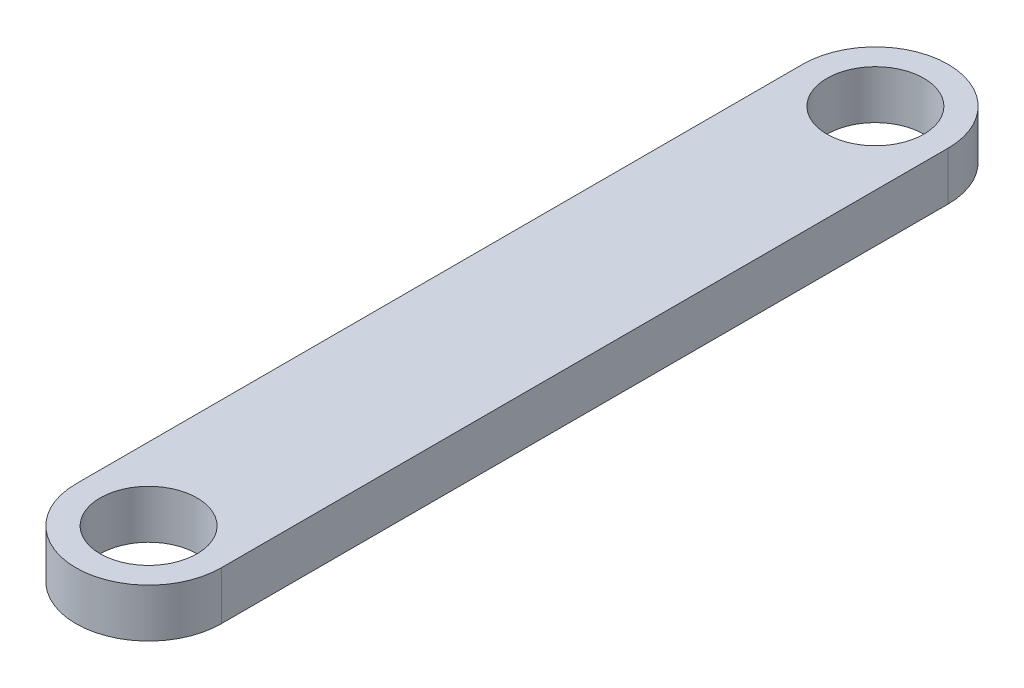
ISO-10303-21;
HEADER;
FILE_DESCRIPTION(('STEP AP214'),'2;1');
FILE_NAME('part.step','',(''),(''),'','','');
FILE_SCHEMA(('AUTOMOTIVE_DESIGN { 1 0 10303 214 1 1 1 1 }'));
ENDSEC;
DATA;
#1=APPLICATION_CONTEXT('core data for automotive mechanical design processes');
#2=APPLICATION_PROTOCOL_DEFINITION('international standard','automotive_design',2000,#1);
#3=PRODUCT_CONTEXT('',#1,'mechanical');
#4=PRODUCT('Part','Part','',(#3));
#5=PRODUCT_RELATED_PRODUCT_CATEGORY('part','',(#4));
#6=PRODUCT_DEFINITION_FORMATION('','',#4);
#7=PRODUCT_DEFINITION_CONTEXT('part definition',#1,'design');
#8=PRODUCT_DEFINITION('design','',#6,#7);
#9=PRODUCT_DEFINITION_SHAPE('','',#8);
#10=(LENGTH_UNIT() NAMED_UNIT(*) SI_UNIT(.MILLI.,.METRE.));
#11=(NAMED_UNIT(*) PLANE_ANGLE_UNIT() SI_UNIT($,.RADIAN.));
#12=(NAMED_UNIT(*) SI_UNIT($,.STERADIAN.) SOLID_ANGLE_UNIT());
#13=UNCERTAINTY_MEASURE_WITH_UNIT(LENGTH_MEASURE(1.E-05),#10,'distance_accuracy_value','');
#14=(GEOMETRIC_REPRESENTATION_CONTEXT(3) GLOBAL_UNCERTAINTY_ASSIGNED_CONTEXT((#13)) GLOBAL_UNIT_ASSIGNED_CONTEXT((#10,
#11,#12)) REPRESENTATION_CONTEXT('',''));
#15=CARTESIAN_POINT('',(0.,0.,0.));
#16=DIRECTION('',(0.,0.,1.));
#17=DIRECTION('',(1.,0.,0.));
#18=AXIS2_PLACEMENT_3D('',#15,#16,#17);
#19=CARTESIAN_POINT('',(0.,2.,0.));
#20=DIRECTION('',(0.,1.,0.));
#21=DIRECTION('',(0.,0.,1.));
#22=AXIS2_PLACEMENT_3D('',#19,#20,#21);
#23=PLANE('',#22);
#24=CARTESIAN_POINT('',(0.,2.,0.));
#25=DIRECTION('',(0.,1.,0.));
#26=DIRECTION('',(0.,0.,1.));
#27=AXIS2_PLACEMENT_3D('',#24,#25,#26);
#28=CIRCLE('',#27,2.);
#29=CARTESIAN_POINT('',(0.,2.,2.));
#30=VERTEX_POINT('',#29);
#31=EDGE_CURVE('E101',#30,#30,#28,.T.);
#32=ORIENTED_EDGE('',*,*,#31,.F.);
#33=EDGE_LOOP('',(#32));
#34=FACE_BOUND('',#33,.T.);
#35=CARTESIAN_POINT('',(0.,2.,0.));
#36=DIRECTION('',(0.,1.,0.));
#37=DIRECTION('',(0.,0.,1.));
#38=AXIS2_PLACEMENT_3D('',#35,#36,#37);
#39=CIRCLE('',#38,3.);
#40=CARTESIAN_POINT('',(-3.,2.,0.));
#41=VERTEX_POINT('',#40);
#42=CARTESIAN_POINT('',(3.,2.,0.));
#43=VERTEX_POINT('',#42);
#44=EDGE_CURVE('E86',#41,#43,#39,.T.);
#45=ORIENTED_EDGE('',*,*,#44,.T.);
#46=DIRECTION('',(0.,0.,-1.));
#47=VECTOR('',#46,1.);
#48=CARTESIAN_POINT('',(3.,2.,-30.));
#49=LINE('',#48,#47);
#50=CARTESIAN_POINT('',(3.,2.,-30.));
#51=VERTEX_POINT('',#50);
#52=EDGE_CURVE('E81',#43,#51,#49,.T.);
#53=ORIENTED_EDGE('',*,*,#52,.T.);
#54=CARTESIAN_POINT('',(0.,2.,-30.));
#55=DIRECTION('',(0.,1.,0.));
#56=DIRECTION('',(0.,0.,-1.));
#57=AXIS2_PLACEMENT_3D('',#54,#55,#56);
#58=CIRCLE('',#57,3.);
#59=CARTESIAN_POINT('',(-3.,2.,-30.));
#60=VERTEX_POINT('',#59);
#61=EDGE_CURVE('E84',#51,#60,#58,.T.);
#62=ORIENTED_EDGE('',*,*,#61,.T.);
#63=DIRECTION('',(0.,0.,1.));
#64=VECTOR('',#63,1.);
#65=CARTESIAN_POINT('',(-3.,2.,0.));
#66=LINE('',#65,#64);
#67=EDGE_CURVE('E51',#60,#41,#66,.T.);
#68=ORIENTED_EDGE('',*,*,#67,.T.);
#69=EDGE_LOOP('',(#45,#53,#62,#68));
#70=FACE_BOUND('',#69,.T.);
#71=CARTESIAN_POINT('',(0.,2.,-30.));
#72=DIRECTION('',(0.,1.,0.));
#73=DIRECTION('',(0.,0.,1.));
#74=AXIS2_PLACEMENT_3D('',#71,#72,#73);
#75=CIRCLE('',#74,2.);
#76=CARTESIAN_POINT('',(0.,2.,-28.));
#77=VERTEX_POINT('',#76);
#78=EDGE_CURVE('E116',#77,#77,#75,.T.);
#79=ORIENTED_EDGE('',*,*,#78,.F.);
#80=EDGE_LOOP('',(#79));
#81=FACE_BOUND('',#80,.T.);
#82=ADVANCED_FACE('F34',(#34,#70,#81),#23,.T.);
#83=CARTESIAN_POINT('',(0.,0.,0.));
#84=DIRECTION('',(0.,1.,0.));
#85=DIRECTION('',(0.,0.,1.));
#86=AXIS2_PLACEMENT_3D('',#83,#84,#85);
#87=PLANE('',#86);
#88=CARTESIAN_POINT('',(0.,0.,0.));
#89=DIRECTION('',(0.,1.,0.));
#90=DIRECTION('',(0.,0.,1.));
#91=AXIS2_PLACEMENT_3D('',#88,#89,#90);
#92=CIRCLE('',#91,3.);
#93=CARTESIAN_POINT('',(-3.,0.,0.));
#94=VERTEX_POINT('',#93);
#95=CARTESIAN_POINT('',(3.,0.,0.));
#96=VERTEX_POINT('',#95);
#97=EDGE_CURVE('E98',#94,#96,#92,.T.);
#98=ORIENTED_EDGE('',*,*,#97,.F.);
#99=DIRECTION('',(0.,0.,1.));
#100=VECTOR('',#99,1.);
#101=CARTESIAN_POINT('',(-3.,0.,0.));
#102=LINE('',#101,#100);
#103=CARTESIAN_POINT('',(-3.,0.,-30.));
#104=VERTEX_POINT('',#103);
#105=EDGE_CURVE('E74',#104,#94,#102,.T.);
#106=ORIENTED_EDGE('',*,*,#105,.F.);
#107=CARTESIAN_POINT('',(0.,0.,-30.));
#108=DIRECTION('',(0.,1.,0.));
#109=DIRECTION('',(0.,0.,-1.));
#110=AXIS2_PLACEMENT_3D('',#107,#108,#109);
#111=CIRCLE('',#110,3.);
#112=CARTESIAN_POINT('',(3.,0.,-30.));
#113=VERTEX_POINT('',#112);
#114=EDGE_CURVE('E68',#113,#104,#111,.T.);
#115=ORIENTED_EDGE('',*,*,#114,.F.);
#116=DIRECTION('',(0.,0.,-1.));
#117=VECTOR('',#116,1.);
#118=CARTESIAN_POINT('',(3.,0.,-30.));
#119=LINE('',#118,#117);
#120=EDGE_CURVE('E90',#96,#113,#119,.T.);
#121=ORIENTED_EDGE('',*,*,#120,.F.);
#122=EDGE_LOOP('',(#98,#106,#115,#121));
#123=FACE_BOUND('',#122,.T.);
#124=CARTESIAN_POINT('',(0.,0.,0.));
#125=DIRECTION('',(0.,1.,0.));
#126=DIRECTION('',(0.,0.,1.));
#127=AXIS2_PLACEMENT_3D('',#124,#125,#126);
#128=CIRCLE('',#127,2.);
#129=CARTESIAN_POINT('',(0.,0.,2.));
#130=VERTEX_POINT('',#129);
#131=EDGE_CURVE('E113',#130,#130,#128,.T.);
#132=ORIENTED_EDGE('',*,*,#131,.T.);
#133=EDGE_LOOP('',(#132));
#134=FACE_BOUND('',#133,.T.);
#135=CARTESIAN_POINT('',(0.,0.,-30.));
#136=DIRECTION('',(0.,1.,0.));
#137=DIRECTION('',(0.,0.,1.));
#138=AXIS2_PLACEMENT_3D('',#135,#136,#137);
#139=CIRCLE('',#138,2.);
#140=CARTESIAN_POINT('',(0.,0.,-28.));
#141=VERTEX_POINT('',#140);
#142=EDGE_CURVE('E119',#141,#141,#139,.T.);
#143=ORIENTED_EDGE('',*,*,#142,.T.);
#144=EDGE_LOOP('',(#143));
#145=FACE_BOUND('',#144,.T.);
#146=ADVANCED_FACE('F109',(#123,#134,#145),#87,.F.);
#147=CARTESIAN_POINT('',(0.,2.,0.));
#148=DIRECTION('',(0.,-1.,0.));
#149=DIRECTION('',(0.,0.,-1.));
#150=AXIS2_PLACEMENT_3D('',#147,#148,#149);
#151=CYLINDRICAL_SURFACE('',#150,3.);
#152=ORIENTED_EDGE('',*,*,#97,.T.);
#153=DIRECTION('',(0.,-1.,0.));
#154=VECTOR('',#153,1.);
#155=CARTESIAN_POINT('',(3.,2.,0.));
#156=LINE('',#155,#154);
#157=EDGE_CURVE('E11',#43,#96,#156,.T.);
#158=ORIENTED_EDGE('',*,*,#157,.F.);
#159=ORIENTED_EDGE('',*,*,#44,.F.);
#160=DIRECTION('',(0.,-1.,0.));
#161=VECTOR('',#160,1.);
#162=CARTESIAN_POINT('',(-3.,2.,0.));
#163=LINE('',#162,#161);
#164=EDGE_CURVE('E94',#41,#94,#163,.T.);
#165=ORIENTED_EDGE('',*,*,#164,.T.);
#166=EDGE_LOOP('',(#152,#158,#159,#165));
#167=FACE_BOUND('',#166,.T.);
#168=ADVANCED_FACE('F36',(#167),#151,.T.);
#169=CARTESIAN_POINT('',(3.,2.,-30.));
#170=DIRECTION('',(-1.,0.,0.));
#171=DIRECTION('',(0.,0.,1.));
#172=AXIS2_PLACEMENT_3D('',#169,#170,#171);
#173=PLANE('',#172);
#174=ORIENTED_EDGE('',*,*,#120,.T.);
#175=DIRECTION('',(0.,-1.,0.));
#176=VECTOR('',#175,1.);
#177=CARTESIAN_POINT('',(3.,2.,-30.));
#178=LINE('',#177,#176);
#179=EDGE_CURVE('E43',#51,#113,#178,.T.);
#180=ORIENTED_EDGE('',*,*,#179,.F.);
#181=ORIENTED_EDGE('',*,*,#52,.F.);
#182=ORIENTED_EDGE('',*,*,#157,.T.);
#183=EDGE_LOOP('',(#174,#180,#181,#182));
#184=FACE_BOUND('',#183,.T.);
#185=ADVANCED_FACE('F89',(#184),#173,.F.);
#186=CARTESIAN_POINT('',(0.,2.,-30.));
#187=DIRECTION('',(0.,-1.,0.));
#188=DIRECTION('',(0.,0.,-1.));
#189=AXIS2_PLACEMENT_3D('',#186,#187,#188);
#190=CYLINDRICAL_SURFACE('',#189,3.);
#191=ORIENTED_EDGE('',*,*,#114,.T.);
#192=DIRECTION('',(0.,-1.,0.));
#193=VECTOR('',#192,1.);
#194=CARTESIAN_POINT('',(-3.,2.,-30.));
#195=LINE('',#194,#193);
#196=EDGE_CURVE('E91',#60,#104,#195,.T.);
#197=ORIENTED_EDGE('',*,*,#196,.F.);
#198=ORIENTED_EDGE('',*,*,#61,.F.);
#199=ORIENTED_EDGE('',*,*,#179,.T.);
#200=EDGE_LOOP('',(#191,#197,#198,#199));
#201=FACE_BOUND('',#200,.T.);
#202=ADVANCED_FACE('F92',(#201),#190,.T.);
#203=CARTESIAN_POINT('',(-3.,2.,0.));
#204=DIRECTION('',(1.,0.,0.));
#205=DIRECTION('',(0.,0.,-1.));
#206=AXIS2_PLACEMENT_3D('',#203,#204,#205);
#207=PLANE('',#206);
#208=ORIENTED_EDGE('',*,*,#105,.T.);
#209=ORIENTED_EDGE('',*,*,#164,.F.);
#210=ORIENTED_EDGE('',*,*,#67,.F.);
#211=ORIENTED_EDGE('',*,*,#196,.T.);
#212=EDGE_LOOP('',(#208,#209,#210,#211));
#213=FACE_BOUND('',#212,.T.);
#214=ADVANCED_FACE('F106',(#213),#207,.F.);
#215=CARTESIAN_POINT('',(0.,2.,0.));
#216=DIRECTION('',(0.,-1.,0.));
#217=DIRECTION('',(0.,0.,-1.));
#218=AXIS2_PLACEMENT_3D('',#215,#216,#217);
#219=CYLINDRICAL_SURFACE('',#218,2.);
#220=ORIENTED_EDGE('',*,*,#31,.T.);
#221=EDGE_LOOP('',(#220));
#222=FACE_BOUND('',#221,.T.);
#223=ORIENTED_EDGE('',*,*,#131,.F.);
#224=EDGE_LOOP('',(#223));
#225=FACE_BOUND('',#224,.T.);
#226=ADVANCED_FACE('F136',(#222,#225),#219,.F.);
#227=CARTESIAN_POINT('',(0.,2.,-30.));
#228=DIRECTION('',(0.,-1.,0.));
#229=DIRECTION('',(0.,0.,-1.));
#230=AXIS2_PLACEMENT_3D('',#227,#228,#229);
#231=CYLINDRICAL_SURFACE('',#230,2.);
#232=ORIENTED_EDGE('',*,*,#78,.T.);
#233=EDGE_LOOP('',(#232));
#234=FACE_BOUND('',#233,.T.);
#235=ORIENTED_EDGE('',*,*,#142,.F.);
#236=EDGE_LOOP('',(#235));
#237=FACE_BOUND('',#236,.T.);
#238=ADVANCED_FACE('F125',(#234,#237),#231,.F.);
#239=CLOSED_SHELL('',(#82,#146,#168,#185,#202,#214,#226,#238));
#240=MANIFOLD_SOLID_BREP('B2',#239);
#241=ADVANCED_BREP_SHAPE_REPRESENTATION('',(#18,#240),#14);
#242=SHAPE_DEFINITION_REPRESENTATION(#9,#241);
ENDSEC;
END-ISO-10303-21;
